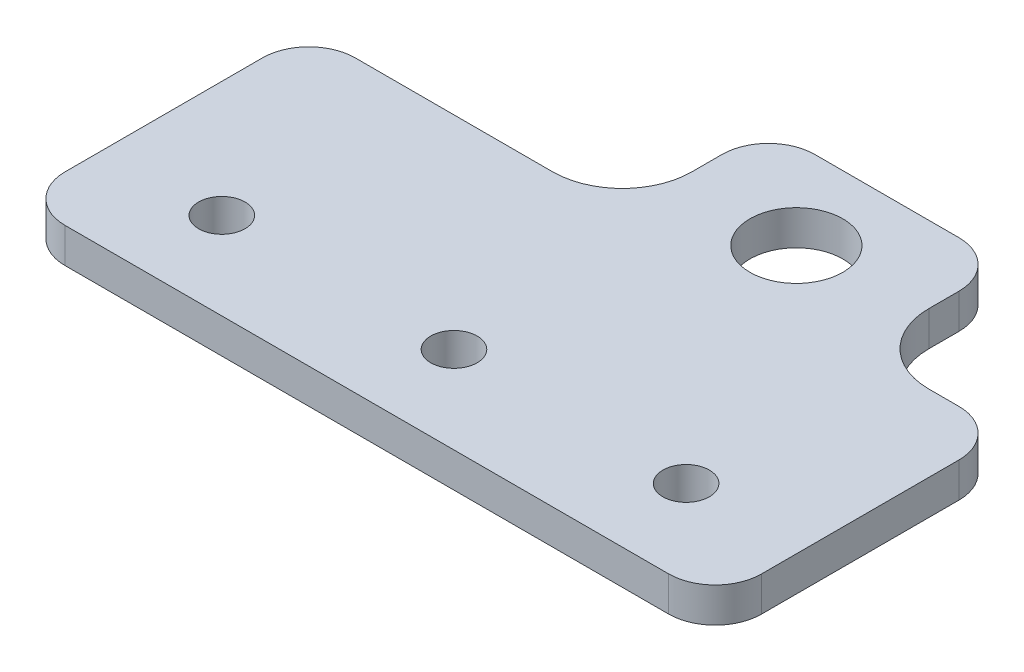
ISO-10303-21;
HEADER;
FILE_DESCRIPTION(('STEP AP214'),'2;1');
FILE_NAME('part.step','',(''),(''),'','','');
FILE_SCHEMA(('AUTOMOTIVE_DESIGN { 1 0 10303 214 1 1 1 1 }'));
ENDSEC;
DATA;
#1=APPLICATION_CONTEXT('core data for automotive mechanical design processes');
#2=APPLICATION_PROTOCOL_DEFINITION('international standard','automotive_design',2000,#1);
#3=PRODUCT_CONTEXT('',#1,'mechanical');
#4=PRODUCT('Part','Part','',(#3));
#5=PRODUCT_RELATED_PRODUCT_CATEGORY('part','',(#4));
#6=PRODUCT_DEFINITION_FORMATION('','',#4);
#7=PRODUCT_DEFINITION_CONTEXT('part definition',#1,'design');
#8=PRODUCT_DEFINITION('design','',#6,#7);
#9=PRODUCT_DEFINITION_SHAPE('','',#8);
#10=(LENGTH_UNIT() NAMED_UNIT(*) SI_UNIT(.MILLI.,.METRE.));
#11=(NAMED_UNIT(*) PLANE_ANGLE_UNIT() SI_UNIT($,.RADIAN.));
#12=(NAMED_UNIT(*) SI_UNIT($,.STERADIAN.) SOLID_ANGLE_UNIT());
#13=UNCERTAINTY_MEASURE_WITH_UNIT(LENGTH_MEASURE(1.E-05),#10,'distance_accuracy_value','');
#14=(GEOMETRIC_REPRESENTATION_CONTEXT(3) GLOBAL_UNCERTAINTY_ASSIGNED_CONTEXT((#13)) GLOBAL_UNIT_ASSIGNED_CONTEXT((#10,
#11,#12)) REPRESENTATION_CONTEXT('',''));
#15=CARTESIAN_POINT('',(0.,0.,0.));
#16=DIRECTION('',(0.,0.,1.));
#17=DIRECTION('',(1.,0.,0.));
#18=AXIS2_PLACEMENT_3D('',#15,#16,#17);
#19=CARTESIAN_POINT('',(0.,3.,0.));
#20=DIRECTION('',(0.,1.,0.));
#21=DIRECTION('',(0.,0.,1.));
#22=AXIS2_PLACEMENT_3D('',#19,#20,#21);
#23=PLANE('',#22);
#24=DIRECTION('',(0.,0.,1.));
#25=VECTOR('',#24,1.);
#26=CARTESIAN_POINT('',(30.,3.,0.));
#27=LINE('',#26,#25);
#28=CARTESIAN_POINT('',(30.,3.,-8.5));
#29=VERTEX_POINT('',#28);
#30=CARTESIAN_POINT('',(30.,3.,8.5));
#31=VERTEX_POINT('',#30);
#32=EDGE_CURVE('E258',#29,#31,#27,.T.);
#33=ORIENTED_EDGE('',*,*,#32,.F.);
#34=CARTESIAN_POINT('',(26.,3.,-8.49999999999999));
#35=DIRECTION('',(0.,1.,0.));
#36=DIRECTION('',(0.,0.,1.));
#37=AXIS2_PLACEMENT_3D('',#34,#35,#36);
#38=CIRCLE('',#37,4.);
#39=CARTESIAN_POINT('',(26.,3.,-12.5));
#40=VERTEX_POINT('',#39);
#41=EDGE_CURVE('E236',#29,#40,#38,.T.);
#42=ORIENTED_EDGE('',*,*,#41,.T.);
#43=DIRECTION('',(-1.,0.,0.));
#44=VECTOR('',#43,1.);
#45=CARTESIAN_POINT('',(0.,3.,-12.5));
#46=LINE('',#45,#44);
#47=CARTESIAN_POINT('',(23.409693229815,3.,-12.5));
#48=VERTEX_POINT('',#47);
#49=EDGE_CURVE('E304',#40,#48,#46,.T.);
#50=ORIENTED_EDGE('',*,*,#49,.T.);
#51=CARTESIAN_POINT('',(23.409693229815,3.,-18.5));
#52=DIRECTION('',(0.,1.,0.));
#53=DIRECTION('',(0.,0.,1.));
#54=AXIS2_PLACEMENT_3D('',#51,#52,#53);
#55=CIRCLE('',#54,6.);
#56=CARTESIAN_POINT('',(17.409693229815,3.,-18.5));
#57=VERTEX_POINT('',#56);
#58=EDGE_CURVE('E176',#48,#57,#55,.F.);
#59=ORIENTED_EDGE('',*,*,#58,.T.);
#60=DIRECTION('',(0.,0.,-1.));
#61=VECTOR('',#60,1.);
#62=CARTESIAN_POINT('',(17.409693229815,3.,0.));
#63=LINE('',#62,#61);
#64=CARTESIAN_POINT('',(17.409693229815,3.,-21.090306770185));
#65=VERTEX_POINT('',#64);
#66=EDGE_CURVE('E298',#57,#65,#63,.T.);
#67=ORIENTED_EDGE('',*,*,#66,.T.);
#68=CARTESIAN_POINT('',(13.409693229815,3.,-21.090306770185));
#69=DIRECTION('',(0.,1.,0.));
#70=DIRECTION('',(0.,0.,1.));
#71=AXIS2_PLACEMENT_3D('',#68,#69,#70);
#72=CIRCLE('',#71,4.);
#73=CARTESIAN_POINT('',(13.409693229815,3.,-25.090306770185));
#74=VERTEX_POINT('',#73);
#75=EDGE_CURVE('E204',#65,#74,#72,.T.);
#76=ORIENTED_EDGE('',*,*,#75,.T.);
#77=DIRECTION('',(1.,0.,0.));
#78=VECTOR('',#77,1.);
#79=CARTESIAN_POINT('',(0.,3.,-25.090306770185));
#80=LINE('',#79,#78);
#81=CARTESIAN_POINT('',(1.,3.,-25.090306770185));
#82=VERTEX_POINT('',#81);
#83=EDGE_CURVE('E291',#82,#74,#80,.T.);
#84=ORIENTED_EDGE('',*,*,#83,.F.);
#85=CARTESIAN_POINT('',(1.,3.,-21.090306770185));
#86=DIRECTION('',(0.,1.,0.));
#87=DIRECTION('',(0.,0.,1.));
#88=AXIS2_PLACEMENT_3D('',#85,#86,#87);
#89=CIRCLE('',#88,4.);
#90=CARTESIAN_POINT('',(-3.,3.,-21.090306770185));
#91=VERTEX_POINT('',#90);
#92=EDGE_CURVE('E202',#82,#91,#89,.T.);
#93=ORIENTED_EDGE('',*,*,#92,.T.);
#94=DIRECTION('',(0.,0.,-1.));
#95=VECTOR('',#94,1.);
#96=CARTESIAN_POINT('',(-3.,3.,0.));
#97=LINE('',#96,#95);
#98=CARTESIAN_POINT('',(-3.,3.,-18.5));
#99=VERTEX_POINT('',#98);
#100=EDGE_CURVE('E303',#99,#91,#97,.T.);
#101=ORIENTED_EDGE('',*,*,#100,.F.);
#102=CARTESIAN_POINT('',(-9.,3.,-18.5));
#103=DIRECTION('',(0.,1.,0.));
#104=DIRECTION('',(0.,0.,1.));
#105=AXIS2_PLACEMENT_3D('',#102,#103,#104);
#106=CIRCLE('',#105,6.);
#107=CARTESIAN_POINT('',(-9.,3.,-12.5));
#108=VERTEX_POINT('',#107);
#109=EDGE_CURVE('E175',#99,#108,#106,.F.);
#110=ORIENTED_EDGE('',*,*,#109,.T.);
#111=DIRECTION('',(1.,0.,0.));
#112=VECTOR('',#111,1.);
#113=CARTESIAN_POINT('',(0.,3.,-12.5));
#114=LINE('',#113,#112);
#115=CARTESIAN_POINT('',(-26.,3.,-12.5));
#116=VERTEX_POINT('',#115);
#117=EDGE_CURVE('E301',#116,#108,#114,.T.);
#118=ORIENTED_EDGE('',*,*,#117,.F.);
#119=CARTESIAN_POINT('',(-26.,3.,-8.49999999999999));
#120=DIRECTION('',(0.,1.,0.));
#121=DIRECTION('',(0.,0.,1.));
#122=AXIS2_PLACEMENT_3D('',#119,#120,#121);
#123=CIRCLE('',#122,4.);
#124=CARTESIAN_POINT('',(-30.,3.,-8.5));
#125=VERTEX_POINT('',#124);
#126=EDGE_CURVE('E231',#116,#125,#123,.T.);
#127=ORIENTED_EDGE('',*,*,#126,.T.);
#128=DIRECTION('',(0.,0.,1.));
#129=VECTOR('',#128,1.);
#130=CARTESIAN_POINT('',(-30.,3.,0.));
#131=LINE('',#130,#129);
#132=CARTESIAN_POINT('',(-30.,3.,8.5));
#133=VERTEX_POINT('',#132);
#134=EDGE_CURVE('E249',#125,#133,#131,.T.);
#135=ORIENTED_EDGE('',*,*,#134,.T.);
#136=CARTESIAN_POINT('',(-26.,3.,8.50000000000001));
#137=DIRECTION('',(0.,1.,0.));
#138=DIRECTION('',(0.,0.,1.));
#139=AXIS2_PLACEMENT_3D('',#136,#137,#138);
#140=CIRCLE('',#139,4.);
#141=CARTESIAN_POINT('',(-26.,3.,12.5));
#142=VERTEX_POINT('',#141);
#143=EDGE_CURVE('E63',#133,#142,#140,.T.);
#144=ORIENTED_EDGE('',*,*,#143,.T.);
#145=DIRECTION('',(1.,0.,0.));
#146=VECTOR('',#145,1.);
#147=CARTESIAN_POINT('',(0.,3.,12.5));
#148=LINE('',#147,#146);
#149=CARTESIAN_POINT('',(26.,3.,12.5));
#150=VERTEX_POINT('',#149);
#151=EDGE_CURVE('E166',#142,#150,#148,.T.);
#152=ORIENTED_EDGE('',*,*,#151,.T.);
#153=CARTESIAN_POINT('',(26.,3.,8.50000000000001));
#154=DIRECTION('',(0.,1.,0.));
#155=DIRECTION('',(0.,0.,1.));
#156=AXIS2_PLACEMENT_3D('',#153,#154,#155);
#157=CIRCLE('',#156,4.);
#158=EDGE_CURVE('E234',#150,#31,#157,.T.);
#159=ORIENTED_EDGE('',*,*,#158,.T.);
#160=EDGE_LOOP('',(#33,#42,#50,#59,#67,#76,#84,#93,#101,#110,#118,#127,#135,#144,#152,#159));
#161=FACE_BOUND('',#160,.T.);
#162=CARTESIAN_POINT('',(7.,3.,-17.5));
#163=DIRECTION('',(0.,1.,0.));
#164=DIRECTION('',(0.,0.,1.));
#165=AXIS2_PLACEMENT_3D('',#162,#163,#164);
#166=CIRCLE('',#165,4.);
#167=CARTESIAN_POINT('',(7.,3.,-13.5));
#168=VERTEX_POINT('',#167);
#169=EDGE_CURVE('E306',#168,#168,#166,.T.);
#170=ORIENTED_EDGE('',*,*,#169,.F.);
#171=EDGE_LOOP('',(#170));
#172=FACE_BOUND('',#171,.T.);
#173=CARTESIAN_POINT('',(20.,3.,5.00000000000001));
#174=DIRECTION('',(0.,1.,0.));
#175=DIRECTION('',(0.,0.,1.));
#176=AXIS2_PLACEMENT_3D('',#173,#174,#175);
#177=CIRCLE('',#176,2.);
#178=CARTESIAN_POINT('',(20.,3.,7.00000000000001));
#179=VERTEX_POINT('',#178);
#180=EDGE_CURVE('E266',#179,#179,#177,.T.);
#181=ORIENTED_EDGE('',*,*,#180,.F.);
#182=EDGE_LOOP('',(#181));
#183=FACE_BOUND('',#182,.T.);
#184=CARTESIAN_POINT('',(-20.,3.,5.00000000000001));
#185=DIRECTION('',(0.,1.,0.));
#186=DIRECTION('',(0.,0.,1.));
#187=AXIS2_PLACEMENT_3D('',#184,#185,#186);
#188=CIRCLE('',#187,2.);
#189=CARTESIAN_POINT('',(-20.,3.,7.00000000000001));
#190=VERTEX_POINT('',#189);
#191=EDGE_CURVE('E269',#190,#190,#188,.T.);
#192=ORIENTED_EDGE('',*,*,#191,.F.);
#193=EDGE_LOOP('',(#192));
#194=FACE_BOUND('',#193,.T.);
#195=CARTESIAN_POINT('',(0.,3.,5.00000000000001));
#196=DIRECTION('',(0.,1.,0.));
#197=DIRECTION('',(0.,0.,1.));
#198=AXIS2_PLACEMENT_3D('',#195,#196,#197);
#199=CIRCLE('',#198,2.);
#200=CARTESIAN_POINT('',(0.,3.,7.00000000000001));
#201=VERTEX_POINT('',#200);
#202=EDGE_CURVE('E317',#201,#201,#199,.T.);
#203=ORIENTED_EDGE('',*,*,#202,.F.);
#204=EDGE_LOOP('',(#203));
#205=FACE_BOUND('',#204,.T.);
#206=ADVANCED_FACE('F41',(#161,#172,#183,#194,#205),#23,.T.);
#207=CARTESIAN_POINT('',(0.,0.,0.));
#208=DIRECTION('',(0.,1.,0.));
#209=DIRECTION('',(0.,0.,1.));
#210=AXIS2_PLACEMENT_3D('',#207,#208,#209);
#211=PLANE('',#210);
#212=CARTESIAN_POINT('',(0.,0.,5.00000000000001));
#213=DIRECTION('',(0.,1.,0.));
#214=DIRECTION('',(0.,0.,1.));
#215=AXIS2_PLACEMENT_3D('',#212,#213,#214);
#216=CIRCLE('',#215,2.);
#217=CARTESIAN_POINT('',(0.,0.,7.00000000000001));
#218=VERTEX_POINT('',#217);
#219=EDGE_CURVE('E328',#218,#218,#216,.T.);
#220=ORIENTED_EDGE('',*,*,#219,.T.);
#221=EDGE_LOOP('',(#220));
#222=FACE_BOUND('',#221,.T.);
#223=CARTESIAN_POINT('',(-20.,0.,5.00000000000001));
#224=DIRECTION('',(0.,1.,0.));
#225=DIRECTION('',(0.,0.,1.));
#226=AXIS2_PLACEMENT_3D('',#223,#224,#225);
#227=CIRCLE('',#226,2.);
#228=CARTESIAN_POINT('',(-20.,0.,7.00000000000001));
#229=VERTEX_POINT('',#228);
#230=EDGE_CURVE('E325',#229,#229,#227,.T.);
#231=ORIENTED_EDGE('',*,*,#230,.T.);
#232=EDGE_LOOP('',(#231));
#233=FACE_BOUND('',#232,.T.);
#234=CARTESIAN_POINT('',(20.,0.,5.00000000000001));
#235=DIRECTION('',(0.,1.,0.));
#236=DIRECTION('',(0.,0.,1.));
#237=AXIS2_PLACEMENT_3D('',#234,#235,#236);
#238=CIRCLE('',#237,2.);
#239=CARTESIAN_POINT('',(20.,0.,7.00000000000001));
#240=VERTEX_POINT('',#239);
#241=EDGE_CURVE('E312',#240,#240,#238,.T.);
#242=ORIENTED_EDGE('',*,*,#241,.T.);
#243=EDGE_LOOP('',(#242));
#244=FACE_BOUND('',#243,.T.);
#245=CARTESIAN_POINT('',(7.,0.,-17.5));
#246=DIRECTION('',(0.,1.,0.));
#247=DIRECTION('',(0.,0.,1.));
#248=AXIS2_PLACEMENT_3D('',#245,#246,#247);
#249=CIRCLE('',#248,4.);
#250=CARTESIAN_POINT('',(7.,0.,-13.5));
#251=VERTEX_POINT('',#250);
#252=EDGE_CURVE('E309',#251,#251,#249,.T.);
#253=ORIENTED_EDGE('',*,*,#252,.T.);
#254=EDGE_LOOP('',(#253));
#255=FACE_BOUND('',#254,.T.);
#256=DIRECTION('',(-1.,0.,0.));
#257=VECTOR('',#256,1.);
#258=CARTESIAN_POINT('',(0.,0.,-12.5));
#259=LINE('',#258,#257);
#260=CARTESIAN_POINT('',(26.,0.,-12.5));
#261=VERTEX_POINT('',#260);
#262=CARTESIAN_POINT('',(23.409693229815,0.,-12.5));
#263=VERTEX_POINT('',#262);
#264=EDGE_CURVE('E156',#261,#263,#259,.T.);
#265=ORIENTED_EDGE('',*,*,#264,.F.);
#266=CARTESIAN_POINT('',(26.,0.,-8.49999999999999));
#267=DIRECTION('',(0.,1.,0.));
#268=DIRECTION('',(0.,0.,1.));
#269=AXIS2_PLACEMENT_3D('',#266,#267,#268);
#270=CIRCLE('',#269,4.);
#271=CARTESIAN_POINT('',(30.,0.,-8.5));
#272=VERTEX_POINT('',#271);
#273=EDGE_CURVE('E224',#261,#272,#270,.F.);
#274=ORIENTED_EDGE('',*,*,#273,.T.);
#275=DIRECTION('',(0.,0.,1.));
#276=VECTOR('',#275,1.);
#277=CARTESIAN_POINT('',(30.,0.,0.));
#278=LINE('',#277,#276);
#279=CARTESIAN_POINT('',(30.,0.,8.5));
#280=VERTEX_POINT('',#279);
#281=EDGE_CURVE('E271',#272,#280,#278,.T.);
#282=ORIENTED_EDGE('',*,*,#281,.T.);
#283=CARTESIAN_POINT('',(26.,0.,8.50000000000001));
#284=DIRECTION('',(0.,1.,0.));
#285=DIRECTION('',(0.,0.,1.));
#286=AXIS2_PLACEMENT_3D('',#283,#284,#285);
#287=CIRCLE('',#286,4.);
#288=CARTESIAN_POINT('',(26.,0.,12.5));
#289=VERTEX_POINT('',#288);
#290=EDGE_CURVE('E222',#280,#289,#287,.F.);
#291=ORIENTED_EDGE('',*,*,#290,.T.);
#292=DIRECTION('',(1.,0.,0.));
#293=VECTOR('',#292,1.);
#294=CARTESIAN_POINT('',(0.,0.,12.5));
#295=LINE('',#294,#293);
#296=CARTESIAN_POINT('',(-26.,0.,12.5));
#297=VERTEX_POINT('',#296);
#298=EDGE_CURVE('E264',#297,#289,#295,.T.);
#299=ORIENTED_EDGE('',*,*,#298,.F.);
#300=CARTESIAN_POINT('',(-26.,0.,8.50000000000001));
#301=DIRECTION('',(0.,1.,0.));
#302=DIRECTION('',(0.,0.,1.));
#303=AXIS2_PLACEMENT_3D('',#300,#301,#302);
#304=CIRCLE('',#303,4.);
#305=CARTESIAN_POINT('',(-30.,0.,8.5));
#306=VERTEX_POINT('',#305);
#307=EDGE_CURVE('E220',#297,#306,#304,.F.);
#308=ORIENTED_EDGE('',*,*,#307,.T.);
#309=DIRECTION('',(0.,0.,1.));
#310=VECTOR('',#309,1.);
#311=CARTESIAN_POINT('',(-30.,0.,0.));
#312=LINE('',#311,#310);
#313=CARTESIAN_POINT('',(-30.,0.,-8.5));
#314=VERTEX_POINT('',#313);
#315=EDGE_CURVE('E252',#314,#306,#312,.T.);
#316=ORIENTED_EDGE('',*,*,#315,.F.);
#317=CARTESIAN_POINT('',(-26.,0.,-8.49999999999999));
#318=DIRECTION('',(0.,1.,0.));
#319=DIRECTION('',(0.,0.,1.));
#320=AXIS2_PLACEMENT_3D('',#317,#318,#319);
#321=CIRCLE('',#320,4.);
#322=CARTESIAN_POINT('',(-26.,0.,-12.5));
#323=VERTEX_POINT('',#322);
#324=EDGE_CURVE('E218',#314,#323,#321,.F.);
#325=ORIENTED_EDGE('',*,*,#324,.T.);
#326=DIRECTION('',(1.,0.,0.));
#327=VECTOR('',#326,1.);
#328=CARTESIAN_POINT('',(0.,0.,-12.5));
#329=LINE('',#328,#327);
#330=CARTESIAN_POINT('',(-9.,0.,-12.5));
#331=VERTEX_POINT('',#330);
#332=EDGE_CURVE('E181',#323,#331,#329,.T.);
#333=ORIENTED_EDGE('',*,*,#332,.T.);
#334=CARTESIAN_POINT('',(-9.,0.,-18.5));
#335=DIRECTION('',(0.,1.,0.));
#336=DIRECTION('',(0.,0.,1.));
#337=AXIS2_PLACEMENT_3D('',#334,#335,#336);
#338=CIRCLE('',#337,6.);
#339=CARTESIAN_POINT('',(-3.,0.,-18.5));
#340=VERTEX_POINT('',#339);
#341=EDGE_CURVE('E197',#331,#340,#338,.T.);
#342=ORIENTED_EDGE('',*,*,#341,.T.);
#343=DIRECTION('',(0.,0.,-1.));
#344=VECTOR('',#343,1.);
#345=CARTESIAN_POINT('',(-3.,0.,0.));
#346=LINE('',#345,#344);
#347=CARTESIAN_POINT('',(-3.,0.,-21.090306770185));
#348=VERTEX_POINT('',#347);
#349=EDGE_CURVE('E185',#340,#348,#346,.T.);
#350=ORIENTED_EDGE('',*,*,#349,.T.);
#351=CARTESIAN_POINT('',(1.,0.,-21.090306770185));
#352=DIRECTION('',(0.,1.,0.));
#353=DIRECTION('',(0.,0.,1.));
#354=AXIS2_PLACEMENT_3D('',#351,#352,#353);
#355=CIRCLE('',#354,4.);
#356=CARTESIAN_POINT('',(1.,0.,-25.090306770185));
#357=VERTEX_POINT('',#356);
#358=EDGE_CURVE('E211',#348,#357,#355,.F.);
#359=ORIENTED_EDGE('',*,*,#358,.T.);
#360=DIRECTION('',(1.,0.,0.));
#361=VECTOR('',#360,1.);
#362=CARTESIAN_POINT('',(0.,0.,-25.090306770185));
#363=LINE('',#362,#361);
#364=CARTESIAN_POINT('',(13.409693229815,0.,-25.090306770185));
#365=VERTEX_POINT('',#364);
#366=EDGE_CURVE('E293',#357,#365,#363,.T.);
#367=ORIENTED_EDGE('',*,*,#366,.T.);
#368=CARTESIAN_POINT('',(13.409693229815,0.,-21.090306770185));
#369=DIRECTION('',(0.,1.,0.));
#370=DIRECTION('',(0.,0.,1.));
#371=AXIS2_PLACEMENT_3D('',#368,#369,#370);
#372=CIRCLE('',#371,4.);
#373=CARTESIAN_POINT('',(17.409693229815,0.,-21.090306770185));
#374=VERTEX_POINT('',#373);
#375=EDGE_CURVE('E213',#365,#374,#372,.F.);
#376=ORIENTED_EDGE('',*,*,#375,.T.);
#377=DIRECTION('',(0.,0.,-1.));
#378=VECTOR('',#377,1.);
#379=CARTESIAN_POINT('',(17.409693229815,0.,0.));
#380=LINE('',#379,#378);
#381=CARTESIAN_POINT('',(17.409693229815,0.,-18.5));
#382=VERTEX_POINT('',#381);
#383=EDGE_CURVE('E165',#382,#374,#380,.T.);
#384=ORIENTED_EDGE('',*,*,#383,.F.);
#385=CARTESIAN_POINT('',(23.409693229815,0.,-18.5));
#386=DIRECTION('',(0.,1.,0.));
#387=DIRECTION('',(0.,0.,1.));
#388=AXIS2_PLACEMENT_3D('',#385,#386,#387);
#389=CIRCLE('',#388,6.);
#390=EDGE_CURVE('E170',#382,#263,#389,.T.);
#391=ORIENTED_EDGE('',*,*,#390,.T.);
#392=EDGE_LOOP('',(#265,#274,#282,#291,#299,#308,#316,#325,#333,#342,#350,#359,#367,#376,#384,#391));
#393=FACE_BOUND('',#392,.T.);
#394=ADVANCED_FACE('F171',(#222,#233,#244,#255,#393),#211,.F.);
#395=CARTESIAN_POINT('',(30.,3.,0.));
#396=DIRECTION('',(1.,0.,0.));
#397=DIRECTION('',(0.,0.,-1.));
#398=AXIS2_PLACEMENT_3D('',#395,#396,#397);
#399=PLANE('',#398);
#400=ORIENTED_EDGE('',*,*,#281,.F.);
#401=DIRECTION('',(0.,-1.,0.));
#402=VECTOR('',#401,1.);
#403=CARTESIAN_POINT('',(30.,3.,-8.5));
#404=LINE('',#403,#402);
#405=EDGE_CURVE('E229',#272,#29,#404,.F.);
#406=ORIENTED_EDGE('',*,*,#405,.T.);
#407=ORIENTED_EDGE('',*,*,#32,.T.);
#408=DIRECTION('',(0.,-1.,0.));
#409=VECTOR('',#408,1.);
#410=CARTESIAN_POINT('',(30.,0.,8.5));
#411=LINE('',#410,#409);
#412=EDGE_CURVE('E226',#31,#280,#411,.T.);
#413=ORIENTED_EDGE('',*,*,#412,.T.);
#414=EDGE_LOOP('',(#400,#406,#407,#413));
#415=FACE_BOUND('',#414,.T.);
#416=ADVANCED_FACE('F333',(#415),#399,.T.);
#417=CARTESIAN_POINT('',(-30.,3.,0.));
#418=DIRECTION('',(1.,0.,0.));
#419=DIRECTION('',(0.,0.,-1.));
#420=AXIS2_PLACEMENT_3D('',#417,#418,#419);
#421=PLANE('',#420);
#422=ORIENTED_EDGE('',*,*,#315,.T.);
#423=DIRECTION('',(0.,-1.,0.));
#424=VECTOR('',#423,1.);
#425=CARTESIAN_POINT('',(-30.,3.,8.5));
#426=LINE('',#425,#424);
#427=EDGE_CURVE('E49',#306,#133,#426,.F.);
#428=ORIENTED_EDGE('',*,*,#427,.T.);
#429=ORIENTED_EDGE('',*,*,#134,.F.);
#430=DIRECTION('',(0.,-1.,0.));
#431=VECTOR('',#430,1.);
#432=CARTESIAN_POINT('',(-30.,3.,-8.5));
#433=LINE('',#432,#431);
#434=EDGE_CURVE('E242',#125,#314,#433,.T.);
#435=ORIENTED_EDGE('',*,*,#434,.T.);
#436=EDGE_LOOP('',(#422,#428,#429,#435));
#437=FACE_BOUND('',#436,.T.);
#438=ADVANCED_FACE('F248',(#437),#421,.F.);
#439=CARTESIAN_POINT('',(0.,3.,5.00000000000001));
#440=DIRECTION('',(0.,-1.,0.));
#441=DIRECTION('',(0.,0.,-1.));
#442=AXIS2_PLACEMENT_3D('',#439,#440,#441);
#443=CYLINDRICAL_SURFACE('',#442,2.);
#444=ORIENTED_EDGE('',*,*,#202,.T.);
#445=EDGE_LOOP('',(#444));
#446=FACE_BOUND('',#445,.T.);
#447=ORIENTED_EDGE('',*,*,#219,.F.);
#448=EDGE_LOOP('',(#447));
#449=FACE_BOUND('',#448,.T.);
#450=ADVANCED_FACE('F364',(#446,#449),#443,.F.);
#451=CARTESIAN_POINT('',(-20.,3.,5.00000000000001));
#452=DIRECTION('',(0.,-1.,0.));
#453=DIRECTION('',(0.,0.,-1.));
#454=AXIS2_PLACEMENT_3D('',#451,#452,#453);
#455=CYLINDRICAL_SURFACE('',#454,2.);
#456=ORIENTED_EDGE('',*,*,#191,.T.);
#457=EDGE_LOOP('',(#456));
#458=FACE_BOUND('',#457,.T.);
#459=ORIENTED_EDGE('',*,*,#230,.F.);
#460=EDGE_LOOP('',(#459));
#461=FACE_BOUND('',#460,.T.);
#462=ADVANCED_FACE('F369',(#458,#461),#455,.F.);
#463=CARTESIAN_POINT('',(20.,3.,5.00000000000001));
#464=DIRECTION('',(0.,-1.,0.));
#465=DIRECTION('',(0.,0.,-1.));
#466=AXIS2_PLACEMENT_3D('',#463,#464,#465);
#467=CYLINDRICAL_SURFACE('',#466,2.);
#468=ORIENTED_EDGE('',*,*,#180,.T.);
#469=EDGE_LOOP('',(#468));
#470=FACE_BOUND('',#469,.T.);
#471=ORIENTED_EDGE('',*,*,#241,.F.);
#472=EDGE_LOOP('',(#471));
#473=FACE_BOUND('',#472,.T.);
#474=ADVANCED_FACE('F361',(#470,#473),#467,.F.);
#475=CARTESIAN_POINT('',(0.,3.,12.5));
#476=DIRECTION('',(0.,0.,-1.));
#477=DIRECTION('',(-1.,0.,0.));
#478=AXIS2_PLACEMENT_3D('',#475,#476,#477);
#479=PLANE('',#478);
#480=ORIENTED_EDGE('',*,*,#298,.T.);
#481=DIRECTION('',(0.,-1.,0.));
#482=VECTOR('',#481,1.);
#483=CARTESIAN_POINT('',(26.,3.,12.5));
#484=LINE('',#483,#482);
#485=EDGE_CURVE('E56',#289,#150,#484,.F.);
#486=ORIENTED_EDGE('',*,*,#485,.T.);
#487=ORIENTED_EDGE('',*,*,#151,.F.);
#488=DIRECTION('',(0.,-1.,0.));
#489=VECTOR('',#488,1.);
#490=CARTESIAN_POINT('',(-26.,3.,12.5));
#491=LINE('',#490,#489);
#492=EDGE_CURVE('E238',#142,#297,#491,.T.);
#493=ORIENTED_EDGE('',*,*,#492,.T.);
#494=EDGE_LOOP('',(#480,#486,#487,#493));
#495=FACE_BOUND('',#494,.T.);
#496=ADVANCED_FACE('F263',(#495),#479,.F.);
#497=CARTESIAN_POINT('',(7.,0.,-17.5));
#498=DIRECTION('',(0.,1.,0.));
#499=DIRECTION('',(0.,0.,1.));
#500=AXIS2_PLACEMENT_3D('',#497,#498,#499);
#501=CYLINDRICAL_SURFACE('',#500,4.);
#502=ORIENTED_EDGE('',*,*,#252,.F.);
#503=EDGE_LOOP('',(#502));
#504=FACE_BOUND('',#503,.T.);
#505=ORIENTED_EDGE('',*,*,#169,.T.);
#506=EDGE_LOOP('',(#505));
#507=FACE_BOUND('',#506,.T.);
#508=ADVANCED_FACE('F356',(#504,#507),#501,.F.);
#509=CARTESIAN_POINT('',(17.409693229815,-7.,0.));
#510=DIRECTION('',(1.,0.,0.));
#511=DIRECTION('',(0.,0.,-1.));
#512=AXIS2_PLACEMENT_3D('',#509,#510,#511);
#513=PLANE('',#512);
#514=ORIENTED_EDGE('',*,*,#383,.T.);
#515=DIRECTION('',(0.,1.,0.));
#516=VECTOR('',#515,1.);
#517=CARTESIAN_POINT('',(17.409693229815,3.,-21.090306770185));
#518=LINE('',#517,#516);
#519=EDGE_CURVE('E199',#374,#65,#518,.T.);
#520=ORIENTED_EDGE('',*,*,#519,.T.);
#521=ORIENTED_EDGE('',*,*,#66,.F.);
#522=DIRECTION('',(0.,1.,0.));
#523=VECTOR('',#522,1.);
#524=CARTESIAN_POINT('',(17.409693229815,0.,-18.5));
#525=LINE('',#524,#523);
#526=EDGE_CURVE('E180',#57,#382,#525,.F.);
#527=ORIENTED_EDGE('',*,*,#526,.T.);
#528=EDGE_LOOP('',(#514,#520,#521,#527));
#529=FACE_BOUND('',#528,.T.);
#530=ADVANCED_FACE('F481',(#529),#513,.T.);
#531=CARTESIAN_POINT('',(0.,-7.,-12.5));
#532=DIRECTION('',(0.,0.,-1.));
#533=DIRECTION('',(-1.,0.,0.));
#534=AXIS2_PLACEMENT_3D('',#531,#532,#533);
#535=PLANE('',#534);
#536=ORIENTED_EDGE('',*,*,#49,.F.);
#537=DIRECTION('',(0.,-1.,0.));
#538=VECTOR('',#537,1.);
#539=CARTESIAN_POINT('',(26.,-7.,-12.5));
#540=LINE('',#539,#538);
#541=EDGE_CURVE('E163',#40,#261,#540,.T.);
#542=ORIENTED_EDGE('',*,*,#541,.T.);
#543=ORIENTED_EDGE('',*,*,#264,.T.);
#544=DIRECTION('',(0.,1.,0.));
#545=VECTOR('',#544,1.);
#546=CARTESIAN_POINT('',(23.409693229815,3.,-12.5));
#547=LINE('',#546,#545);
#548=EDGE_CURVE('E161',#263,#48,#547,.T.);
#549=ORIENTED_EDGE('',*,*,#548,.T.);
#550=EDGE_LOOP('',(#536,#542,#543,#549));
#551=FACE_BOUND('',#550,.T.);
#552=ADVANCED_FACE('F159',(#551),#535,.T.);
#553=CARTESIAN_POINT('',(0.,-7.,-12.5));
#554=DIRECTION('',(0.,0.,1.));
#555=DIRECTION('',(1.,0.,0.));
#556=AXIS2_PLACEMENT_3D('',#553,#554,#555);
#557=PLANE('',#556);
#558=ORIENTED_EDGE('',*,*,#332,.F.);
#559=DIRECTION('',(0.,-1.,0.));
#560=VECTOR('',#559,1.);
#561=CARTESIAN_POINT('',(-26.,-7.,-12.5));
#562=LINE('',#561,#560);
#563=EDGE_CURVE('E11',#323,#116,#562,.F.);
#564=ORIENTED_EDGE('',*,*,#563,.T.);
#565=ORIENTED_EDGE('',*,*,#117,.T.);
#566=DIRECTION('',(0.,1.,0.));
#567=VECTOR('',#566,1.);
#568=CARTESIAN_POINT('',(-9.,0.,-12.5));
#569=LINE('',#568,#567);
#570=EDGE_CURVE('E191',#108,#331,#569,.F.);
#571=ORIENTED_EDGE('',*,*,#570,.T.);
#572=EDGE_LOOP('',(#558,#564,#565,#571));
#573=FACE_BOUND('',#572,.T.);
#574=ADVANCED_FACE('F403',(#573),#557,.F.);
#575=CARTESIAN_POINT('',(-3.,-7.,0.));
#576=DIRECTION('',(1.,0.,0.));
#577=DIRECTION('',(0.,0.,-1.));
#578=AXIS2_PLACEMENT_3D('',#575,#576,#577);
#579=PLANE('',#578);
#580=ORIENTED_EDGE('',*,*,#100,.T.);
#581=DIRECTION('',(0.,1.,0.));
#582=VECTOR('',#581,1.);
#583=CARTESIAN_POINT('',(-3.,-7.,-21.090306770185));
#584=LINE('',#583,#582);
#585=EDGE_CURVE('E215',#91,#348,#584,.F.);
#586=ORIENTED_EDGE('',*,*,#585,.T.);
#587=ORIENTED_EDGE('',*,*,#349,.F.);
#588=DIRECTION('',(0.,1.,0.));
#589=VECTOR('',#588,1.);
#590=CARTESIAN_POINT('',(-3.,3.,-18.5));
#591=LINE('',#590,#589);
#592=EDGE_CURVE('E183',#340,#99,#591,.T.);
#593=ORIENTED_EDGE('',*,*,#592,.T.);
#594=EDGE_LOOP('',(#580,#586,#587,#593));
#595=FACE_BOUND('',#594,.T.);
#596=ADVANCED_FACE('F458',(#595),#579,.F.);
#597=CARTESIAN_POINT('',(0.,-7.,-25.090306770185));
#598=DIRECTION('',(0.,0.,1.));
#599=DIRECTION('',(1.,0.,0.));
#600=AXIS2_PLACEMENT_3D('',#597,#598,#599);
#601=PLANE('',#600);
#602=ORIENTED_EDGE('',*,*,#83,.T.);
#603=DIRECTION('',(0.,1.,0.));
#604=VECTOR('',#603,1.);
#605=CARTESIAN_POINT('',(13.409693229815,0.,-25.090306770185));
#606=LINE('',#605,#604);
#607=EDGE_CURVE('E209',#74,#365,#606,.F.);
#608=ORIENTED_EDGE('',*,*,#607,.T.);
#609=ORIENTED_EDGE('',*,*,#366,.F.);
#610=DIRECTION('',(0.,1.,0.));
#611=VECTOR('',#610,1.);
#612=CARTESIAN_POINT('',(1.,-7.,-25.090306770185));
#613=LINE('',#612,#611);
#614=EDGE_CURVE('E206',#357,#82,#613,.T.);
#615=ORIENTED_EDGE('',*,*,#614,.T.);
#616=EDGE_LOOP('',(#602,#608,#609,#615));
#617=FACE_BOUND('',#616,.T.);
#618=ADVANCED_FACE('F290',(#617),#601,.F.);
#619=CARTESIAN_POINT('',(23.409693229815,-7.,-18.5));
#620=DIRECTION('',(0.,-1.,0.));
#621=DIRECTION('',(0.,0.,-1.));
#622=AXIS2_PLACEMENT_3D('',#619,#620,#621);
#623=CYLINDRICAL_SURFACE('',#622,6.);
#624=ORIENTED_EDGE('',*,*,#390,.F.);
#625=ORIENTED_EDGE('',*,*,#526,.F.);
#626=ORIENTED_EDGE('',*,*,#58,.F.);
#627=ORIENTED_EDGE('',*,*,#548,.F.);
#628=EDGE_LOOP('',(#624,#625,#626,#627));
#629=FACE_BOUND('',#628,.T.);
#630=ADVANCED_FACE('F179',(#629),#623,.F.);
#631=CARTESIAN_POINT('',(-9.,-7.,-18.5));
#632=DIRECTION('',(0.,-1.,0.));
#633=DIRECTION('',(0.,0.,-1.));
#634=AXIS2_PLACEMENT_3D('',#631,#632,#633);
#635=CYLINDRICAL_SURFACE('',#634,6.);
#636=ORIENTED_EDGE('',*,*,#341,.F.);
#637=ORIENTED_EDGE('',*,*,#570,.F.);
#638=ORIENTED_EDGE('',*,*,#109,.F.);
#639=ORIENTED_EDGE('',*,*,#592,.F.);
#640=EDGE_LOOP('',(#636,#637,#638,#639));
#641=FACE_BOUND('',#640,.T.);
#642=ADVANCED_FACE('F379',(#641),#635,.F.);
#643=CARTESIAN_POINT('',(13.409693229815,-7.,-21.090306770185));
#644=DIRECTION('',(0.,-1.,0.));
#645=DIRECTION('',(0.,0.,-1.));
#646=AXIS2_PLACEMENT_3D('',#643,#644,#645);
#647=CYLINDRICAL_SURFACE('',#646,4.);
#648=ORIENTED_EDGE('',*,*,#375,.F.);
#649=ORIENTED_EDGE('',*,*,#607,.F.);
#650=ORIENTED_EDGE('',*,*,#75,.F.);
#651=ORIENTED_EDGE('',*,*,#519,.F.);
#652=EDGE_LOOP('',(#648,#649,#650,#651));
#653=FACE_BOUND('',#652,.T.);
#654=ADVANCED_FACE('F382',(#653),#647,.T.);
#655=CARTESIAN_POINT('',(1.,-7.,-21.090306770185));
#656=DIRECTION('',(0.,1.,0.));
#657=DIRECTION('',(0.,0.,1.));
#658=AXIS2_PLACEMENT_3D('',#655,#656,#657);
#659=CYLINDRICAL_SURFACE('',#658,4.);
#660=ORIENTED_EDGE('',*,*,#358,.F.);
#661=ORIENTED_EDGE('',*,*,#585,.F.);
#662=ORIENTED_EDGE('',*,*,#92,.F.);
#663=ORIENTED_EDGE('',*,*,#614,.F.);
#664=EDGE_LOOP('',(#660,#661,#662,#663));
#665=FACE_BOUND('',#664,.T.);
#666=ADVANCED_FACE('F286',(#665),#659,.T.);
#667=CARTESIAN_POINT('',(26.,-7.,-8.49999999999999));
#668=DIRECTION('',(0.,-1.,0.));
#669=DIRECTION('',(0.,0.,-1.));
#670=AXIS2_PLACEMENT_3D('',#667,#668,#669);
#671=CYLINDRICAL_SURFACE('',#670,4.);
#672=ORIENTED_EDGE('',*,*,#41,.F.);
#673=ORIENTED_EDGE('',*,*,#405,.F.);
#674=ORIENTED_EDGE('',*,*,#273,.F.);
#675=ORIENTED_EDGE('',*,*,#541,.F.);
#676=EDGE_LOOP('',(#672,#673,#674,#675));
#677=FACE_BOUND('',#676,.T.);
#678=ADVANCED_FACE('F337',(#677),#671,.T.);
#679=CARTESIAN_POINT('',(26.,3.,8.50000000000001));
#680=DIRECTION('',(0.,1.,0.));
#681=DIRECTION('',(0.,0.,1.));
#682=AXIS2_PLACEMENT_3D('',#679,#680,#681);
#683=CYLINDRICAL_SURFACE('',#682,4.);
#684=ORIENTED_EDGE('',*,*,#158,.F.);
#685=ORIENTED_EDGE('',*,*,#485,.F.);
#686=ORIENTED_EDGE('',*,*,#290,.F.);
#687=ORIENTED_EDGE('',*,*,#412,.F.);
#688=EDGE_LOOP('',(#684,#685,#686,#687));
#689=FACE_BOUND('',#688,.T.);
#690=ADVANCED_FACE('F340',(#689),#683,.T.);
#691=CARTESIAN_POINT('',(-26.,3.,8.50000000000001));
#692=DIRECTION('',(0.,-1.,0.));
#693=DIRECTION('',(0.,0.,-1.));
#694=AXIS2_PLACEMENT_3D('',#691,#692,#693);
#695=CYLINDRICAL_SURFACE('',#694,4.);
#696=ORIENTED_EDGE('',*,*,#143,.F.);
#697=ORIENTED_EDGE('',*,*,#427,.F.);
#698=ORIENTED_EDGE('',*,*,#307,.F.);
#699=ORIENTED_EDGE('',*,*,#492,.F.);
#700=EDGE_LOOP('',(#696,#697,#698,#699));
#701=FACE_BOUND('',#700,.T.);
#702=ADVANCED_FACE('F261',(#701),#695,.T.);
#703=CARTESIAN_POINT('',(-26.,3.,-8.49999999999999));
#704=DIRECTION('',(0.,-1.,0.));
#705=DIRECTION('',(0.,0.,-1.));
#706=AXIS2_PLACEMENT_3D('',#703,#704,#705);
#707=CYLINDRICAL_SURFACE('',#706,4.);
#708=ORIENTED_EDGE('',*,*,#126,.F.);
#709=ORIENTED_EDGE('',*,*,#563,.F.);
#710=ORIENTED_EDGE('',*,*,#324,.F.);
#711=ORIENTED_EDGE('',*,*,#434,.F.);
#712=EDGE_LOOP('',(#708,#709,#710,#711));
#713=FACE_BOUND('',#712,.T.);
#714=ADVANCED_FACE('F43',(#713),#707,.T.);
#715=CLOSED_SHELL('',(#206,#394,#416,#438,#450,#462,#474,#496,#508,#530,#552,#574,#596,#618,
#630,#642,#654,#666,#678,#690,#702,#714));
#716=MANIFOLD_SOLID_BREP('B2',#715);
#717=ADVANCED_BREP_SHAPE_REPRESENTATION('',(#18,#716),#14);
#718=SHAPE_DEFINITION_REPRESENTATION(#9,#717);
ENDSEC;
END-ISO-10303-21;
